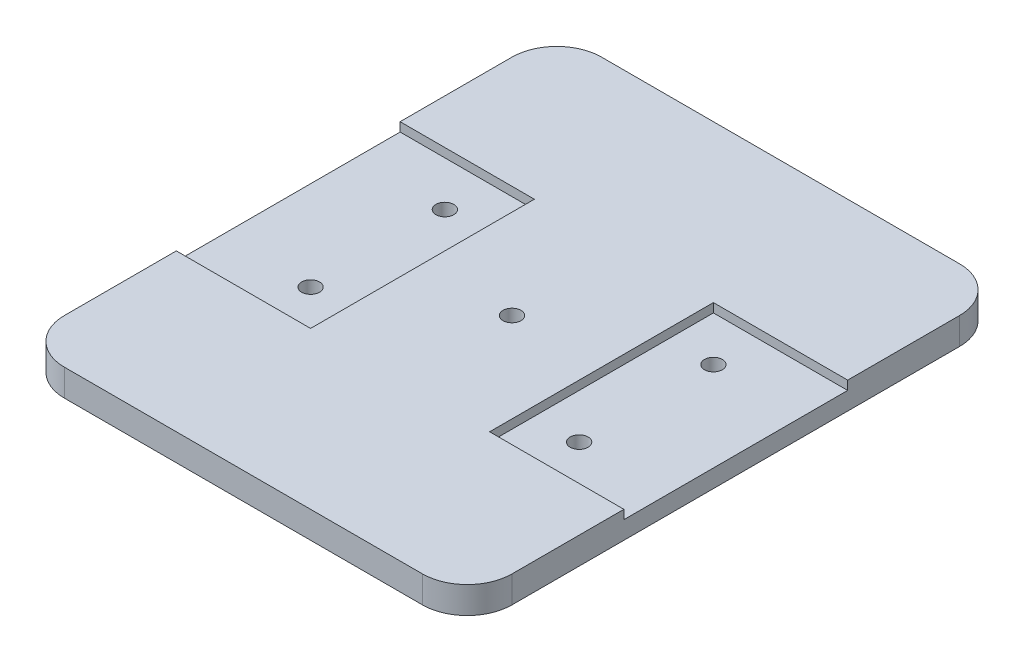
ISO-10303-21;
HEADER;
FILE_DESCRIPTION(('STEP AP214'),'2;1');
FILE_NAME('part.step','',(''),(''),'','','');
FILE_SCHEMA(('AUTOMOTIVE_DESIGN { 1 0 10303 214 1 1 1 1 }'));
ENDSEC;
DATA;
#1=APPLICATION_CONTEXT('core data for automotive mechanical design processes');
#2=APPLICATION_PROTOCOL_DEFINITION('international standard','automotive_design',2000,#1);
#3=PRODUCT_CONTEXT('',#1,'mechanical');
#4=PRODUCT('Part','Part','',(#3));
#5=PRODUCT_RELATED_PRODUCT_CATEGORY('part','',(#4));
#6=PRODUCT_DEFINITION_FORMATION('','',#4);
#7=PRODUCT_DEFINITION_CONTEXT('part definition',#1,'design');
#8=PRODUCT_DEFINITION('design','',#6,#7);
#9=PRODUCT_DEFINITION_SHAPE('','',#8);
#10=(LENGTH_UNIT() NAMED_UNIT(*) SI_UNIT(.MILLI.,.METRE.));
#11=(NAMED_UNIT(*) PLANE_ANGLE_UNIT() SI_UNIT($,.RADIAN.));
#12=(NAMED_UNIT(*) SI_UNIT($,.STERADIAN.) SOLID_ANGLE_UNIT());
#13=UNCERTAINTY_MEASURE_WITH_UNIT(LENGTH_MEASURE(1.E-05),#10,'distance_accuracy_value','');
#14=(GEOMETRIC_REPRESENTATION_CONTEXT(3) GLOBAL_UNCERTAINTY_ASSIGNED_CONTEXT((#13)) GLOBAL_UNIT_ASSIGNED_CONTEXT((#10,
#11,#12)) REPRESENTATION_CONTEXT('',''));
#15=CARTESIAN_POINT('',(0.,0.,0.));
#16=DIRECTION('',(0.,0.,1.));
#17=DIRECTION('',(1.,0.,0.));
#18=AXIS2_PLACEMENT_3D('',#15,#16,#17);
#19=CARTESIAN_POINT('',(-47.2549019607844,3.,-3.77450980392158));
#20=DIRECTION('',(0.,-1.,0.));
#21=DIRECTION('',(0.,0.,-1.));
#22=AXIS2_PLACEMENT_3D('',#19,#20,#21);
#23=CYLINDRICAL_SURFACE('',#22,0.999999999999998);
#24=CARTESIAN_POINT('',(-47.2549019607844,0.,-3.77450980392158));
#25=DIRECTION('',(0.,1.,0.));
#26=DIRECTION('',(0.,0.,1.));
#27=AXIS2_PLACEMENT_3D('',#24,#25,#26);
#28=CIRCLE('',#27,0.999999999999998);
#29=CARTESIAN_POINT('',(-47.2549019607844,0.,-2.77450980392158));
#30=VERTEX_POINT('',#29);
#31=EDGE_CURVE('E251',#30,#30,#28,.T.);
#32=ORIENTED_EDGE('',*,*,#31,.F.);
#33=EDGE_LOOP('',(#32));
#34=FACE_BOUND('',#33,.T.);
#35=CARTESIAN_POINT('',(-47.2549019607844,2.,-3.77450980392158));
#36=DIRECTION('',(0.,1.,0.));
#37=DIRECTION('',(0.,0.,1.));
#38=AXIS2_PLACEMENT_3D('',#35,#36,#37);
#39=CIRCLE('',#38,0.999999999999998);
#40=CARTESIAN_POINT('',(-47.2549019607844,2.,-2.77450980392158));
#41=VERTEX_POINT('',#40);
#42=EDGE_CURVE('E235',#41,#41,#39,.T.);
#43=ORIENTED_EDGE('',*,*,#42,.T.);
#44=EDGE_LOOP('',(#43));
#45=FACE_BOUND('',#44,.T.);
#46=ADVANCED_FACE('F43',(#34,#45),#23,.F.);
#47=CARTESIAN_POINT('',(-47.2549019607844,3.,11.2254901960784));
#48=DIRECTION('',(0.,-1.,0.));
#49=DIRECTION('',(0.,0.,-1.));
#50=AXIS2_PLACEMENT_3D('',#47,#48,#49);
#51=CYLINDRICAL_SURFACE('',#50,0.999999999999998);
#52=CARTESIAN_POINT('',(-47.2549019607844,0.,11.2254901960784));
#53=DIRECTION('',(0.,1.,0.));
#54=DIRECTION('',(0.,0.,1.));
#55=AXIS2_PLACEMENT_3D('',#52,#53,#54);
#56=CIRCLE('',#55,0.999999999999998);
#57=CARTESIAN_POINT('',(-47.2549019607844,0.,12.2254901960784));
#58=VERTEX_POINT('',#57);
#59=EDGE_CURVE('E247',#58,#58,#56,.T.);
#60=ORIENTED_EDGE('',*,*,#59,.F.);
#61=EDGE_LOOP('',(#60));
#62=FACE_BOUND('',#61,.T.);
#63=CARTESIAN_POINT('',(-47.2549019607844,2.,11.2254901960784));
#64=DIRECTION('',(0.,1.,0.));
#65=DIRECTION('',(0.,0.,1.));
#66=AXIS2_PLACEMENT_3D('',#63,#64,#65);
#67=CIRCLE('',#66,0.999999999999998);
#68=CARTESIAN_POINT('',(-47.2549019607844,2.,12.2254901960784));
#69=VERTEX_POINT('',#68);
#70=EDGE_CURVE('E226',#69,#69,#67,.T.);
#71=ORIENTED_EDGE('',*,*,#70,.T.);
#72=EDGE_LOOP('',(#71));
#73=FACE_BOUND('',#72,.T.);
#74=ADVANCED_FACE('F346',(#62,#73),#51,.F.);
#75=CARTESIAN_POINT('',(-52.2549019607844,3.,28.7254901960784));
#76=DIRECTION('',(0.,1.,0.));
#77=DIRECTION('',(0.,0.,1.));
#78=AXIS2_PLACEMENT_3D('',#75,#76,#77);
#79=PLANE('',#78);
#80=DIRECTION('',(1.,0.,0.));
#81=VECTOR('',#80,1.);
#82=CARTESIAN_POINT('',(-7.25490196078435,3.,16.2254901960784));
#83=LINE('',#82,#81);
#84=CARTESIAN_POINT('',(-22.2549019607843,3.,16.2254901960784));
#85=VERTEX_POINT('',#84);
#86=CARTESIAN_POINT('',(-7.25490196078435,3.,16.2254901960784));
#87=VERTEX_POINT('',#86);
#88=EDGE_CURVE('E179',#85,#87,#83,.T.);
#89=ORIENTED_EDGE('',*,*,#88,.F.);
#90=DIRECTION('',(0.,0.,1.));
#91=VECTOR('',#90,1.);
#92=CARTESIAN_POINT('',(-22.2549019607843,3.,-8.77450980392157));
#93=LINE('',#92,#91);
#94=CARTESIAN_POINT('',(-22.2549019607843,3.,-8.77450980392157));
#95=VERTEX_POINT('',#94);
#96=EDGE_CURVE('E403',#95,#85,#93,.T.);
#97=ORIENTED_EDGE('',*,*,#96,.F.);
#98=DIRECTION('',(-1.,0.,0.));
#99=VECTOR('',#98,1.);
#100=CARTESIAN_POINT('',(-7.25490196078435,3.,-8.77450980392157));
#101=LINE('',#100,#99);
#102=CARTESIAN_POINT('',(-7.25490196078435,3.,-8.77450980392157));
#103=VERTEX_POINT('',#102);
#104=EDGE_CURVE('E408',#103,#95,#101,.T.);
#105=ORIENTED_EDGE('',*,*,#104,.F.);
#106=DIRECTION('',(0.,0.,-1.));
#107=VECTOR('',#106,1.);
#108=CARTESIAN_POINT('',(-7.25490196078435,3.,-21.2745098039215));
#109=LINE('',#108,#107);
#110=CARTESIAN_POINT('',(-7.25490196078435,3.,-21.2745098039215));
#111=VERTEX_POINT('',#110);
#112=EDGE_CURVE('E184',#103,#111,#109,.T.);
#113=ORIENTED_EDGE('',*,*,#112,.T.);
#114=CARTESIAN_POINT('',(-12.2549019607843,3.,-21.2745098039216));
#115=DIRECTION('',(0.,1.,0.));
#116=DIRECTION('',(0.,0.,-1.));
#117=AXIS2_PLACEMENT_3D('',#114,#115,#116);
#118=CIRCLE('',#117,5.);
#119=CARTESIAN_POINT('',(-12.2549019607844,3.,-26.2745098039216));
#120=VERTEX_POINT('',#119);
#121=EDGE_CURVE('E279',#111,#120,#118,.T.);
#122=ORIENTED_EDGE('',*,*,#121,.T.);
#123=DIRECTION('',(-1.,0.,0.));
#124=VECTOR('',#123,1.);
#125=CARTESIAN_POINT('',(-52.2549019607843,3.,-26.2745098039216));
#126=LINE('',#125,#124);
#127=CARTESIAN_POINT('',(-52.2549019607843,3.,-26.2745098039216));
#128=VERTEX_POINT('',#127);
#129=EDGE_CURVE('E282',#120,#128,#126,.T.);
#130=ORIENTED_EDGE('',*,*,#129,.T.);
#131=CARTESIAN_POINT('',(-52.2549019607844,3.,-21.2745098039216));
#132=DIRECTION('',(0.,1.,0.));
#133=DIRECTION('',(0.,0.,1.));
#134=AXIS2_PLACEMENT_3D('',#131,#132,#133);
#135=CIRCLE('',#134,5.);
#136=CARTESIAN_POINT('',(-57.2549019607844,3.,-21.2745098039215));
#137=VERTEX_POINT('',#136);
#138=EDGE_CURVE('E285',#128,#137,#135,.T.);
#139=ORIENTED_EDGE('',*,*,#138,.T.);
#140=DIRECTION('',(0.,0.,1.));
#141=VECTOR('',#140,1.);
#142=CARTESIAN_POINT('',(-57.2549019607844,3.,-21.2745098039215));
#143=LINE('',#142,#141);
#144=CARTESIAN_POINT('',(-57.2549019607844,3.,-8.77450980392157));
#145=VERTEX_POINT('',#144);
#146=EDGE_CURVE('E289',#137,#145,#143,.T.);
#147=ORIENTED_EDGE('',*,*,#146,.T.);
#148=DIRECTION('',(-1.,0.,0.));
#149=VECTOR('',#148,1.);
#150=CARTESIAN_POINT('',(-57.2549019607844,3.,-8.77450980392157));
#151=LINE('',#150,#149);
#152=CARTESIAN_POINT('',(-42.2549019607844,3.,-8.77450980392157));
#153=VERTEX_POINT('',#152);
#154=EDGE_CURVE('E203',#153,#145,#151,.T.);
#155=ORIENTED_EDGE('',*,*,#154,.F.);
#156=DIRECTION('',(0.,0.,-1.));
#157=VECTOR('',#156,1.);
#158=CARTESIAN_POINT('',(-42.2549019607844,3.,-8.77450980392157));
#159=LINE('',#158,#157);
#160=CARTESIAN_POINT('',(-42.2549019607844,3.,16.2254901960784));
#161=VERTEX_POINT('',#160);
#162=EDGE_CURVE('E216',#161,#153,#159,.T.);
#163=ORIENTED_EDGE('',*,*,#162,.F.);
#164=DIRECTION('',(1.,0.,0.));
#165=VECTOR('',#164,1.);
#166=CARTESIAN_POINT('',(-57.2549019607844,3.,16.2254901960784));
#167=LINE('',#166,#165);
#168=CARTESIAN_POINT('',(-57.2549019607844,3.,16.2254901960784));
#169=VERTEX_POINT('',#168);
#170=EDGE_CURVE('E198',#169,#161,#167,.T.);
#171=ORIENTED_EDGE('',*,*,#170,.F.);
#172=CARTESIAN_POINT('',(-57.2549019607844,3.,28.7254901960784));
#173=VERTEX_POINT('',#172);
#174=EDGE_CURVE('E288',#169,#173,#143,.T.);
#175=ORIENTED_EDGE('',*,*,#174,.T.);
#176=CARTESIAN_POINT('',(-52.2549019607844,3.,28.7254901960784));
#177=DIRECTION('',(0.,1.,0.));
#178=DIRECTION('',(0.,0.,1.));
#179=AXIS2_PLACEMENT_3D('',#176,#177,#178);
#180=CIRCLE('',#179,5.);
#181=CARTESIAN_POINT('',(-52.2549019607843,3.,33.7254901960784));
#182=VERTEX_POINT('',#181);
#183=EDGE_CURVE('E264',#173,#182,#180,.T.);
#184=ORIENTED_EDGE('',*,*,#183,.T.);
#185=DIRECTION('',(1.,0.,0.));
#186=VECTOR('',#185,1.);
#187=CARTESIAN_POINT('',(-52.2549019607843,3.,33.7254901960784));
#188=LINE('',#187,#186);
#189=CARTESIAN_POINT('',(-12.2549019607844,3.,33.7254901960784));
#190=VERTEX_POINT('',#189);
#191=EDGE_CURVE('E268',#182,#190,#188,.T.);
#192=ORIENTED_EDGE('',*,*,#191,.T.);
#193=CARTESIAN_POINT('',(-12.2549019607843,3.,28.7254901960784));
#194=DIRECTION('',(0.,1.,0.));
#195=DIRECTION('',(0.,0.,1.));
#196=AXIS2_PLACEMENT_3D('',#193,#194,#195);
#197=CIRCLE('',#196,5.);
#198=CARTESIAN_POINT('',(-7.25490196078435,3.,28.7254901960784));
#199=VERTEX_POINT('',#198);
#200=EDGE_CURVE('E272',#190,#199,#197,.T.);
#201=ORIENTED_EDGE('',*,*,#200,.T.);
#202=EDGE_CURVE('E275',#199,#87,#109,.T.);
#203=ORIENTED_EDGE('',*,*,#202,.T.);
#204=EDGE_LOOP('',(#89,#97,#105,#113,#122,#130,#139,#147,#155,#163,#171,#175,#184,#192,#201,#203));
#205=FACE_BOUND('',#204,.T.);
#206=CARTESIAN_POINT('',(-32.2549019607844,3.,3.72549019607842));
#207=DIRECTION('',(0.,1.,0.));
#208=DIRECTION('',(0.,0.,1.));
#209=AXIS2_PLACEMENT_3D('',#206,#207,#208);
#210=CIRCLE('',#209,0.999999999999998);
#211=CARTESIAN_POINT('',(-32.2549019607844,3.,4.72549019607842));
#212=VERTEX_POINT('',#211);
#213=EDGE_CURVE('E256',#212,#212,#210,.T.);
#214=ORIENTED_EDGE('',*,*,#213,.F.);
#215=EDGE_LOOP('',(#214));
#216=FACE_BOUND('',#215,.T.);
#217=ADVANCED_FACE('F365',(#205,#216),#79,.T.);
#218=CARTESIAN_POINT('',(-52.2549019607844,0.,28.7254901960784));
#219=DIRECTION('',(0.,1.,0.));
#220=DIRECTION('',(0.,0.,1.));
#221=AXIS2_PLACEMENT_3D('',#218,#219,#220);
#222=PLANE('',#221);
#223=CARTESIAN_POINT('',(-52.2549019607844,0.,28.7254901960784));
#224=DIRECTION('',(0.,1.,0.));
#225=DIRECTION('',(0.,0.,1.));
#226=AXIS2_PLACEMENT_3D('',#223,#224,#225);
#227=CIRCLE('',#226,5.);
#228=CARTESIAN_POINT('',(-57.2549019607844,0.,28.7254901960784));
#229=VERTEX_POINT('',#228);
#230=CARTESIAN_POINT('',(-52.2549019607843,0.,33.7254901960784));
#231=VERTEX_POINT('',#230);
#232=EDGE_CURVE('E260',#229,#231,#227,.T.);
#233=ORIENTED_EDGE('',*,*,#232,.F.);
#234=DIRECTION('',(0.,0.,1.));
#235=VECTOR('',#234,1.);
#236=CARTESIAN_POINT('',(-57.2549019607844,0.,-21.2745098039215));
#237=LINE('',#236,#235);
#238=CARTESIAN_POINT('',(-57.2549019607844,0.,-21.2745098039215));
#239=VERTEX_POINT('',#238);
#240=EDGE_CURVE('E269',#239,#229,#237,.T.);
#241=ORIENTED_EDGE('',*,*,#240,.F.);
#242=CARTESIAN_POINT('',(-52.2549019607844,0.,-21.2745098039216));
#243=DIRECTION('',(0.,1.,0.));
#244=DIRECTION('',(0.,0.,1.));
#245=AXIS2_PLACEMENT_3D('',#242,#243,#244);
#246=CIRCLE('',#245,5.);
#247=CARTESIAN_POINT('',(-52.2549019607843,0.,-26.2745098039216));
#248=VERTEX_POINT('',#247);
#249=EDGE_CURVE('E312',#248,#239,#246,.T.);
#250=ORIENTED_EDGE('',*,*,#249,.F.);
#251=DIRECTION('',(-1.,0.,0.));
#252=VECTOR('',#251,1.);
#253=CARTESIAN_POINT('',(-52.2549019607843,0.,-26.2745098039216));
#254=LINE('',#253,#252);
#255=CARTESIAN_POINT('',(-12.2549019607844,0.,-26.2745098039216));
#256=VERTEX_POINT('',#255);
#257=EDGE_CURVE('E309',#256,#248,#254,.T.);
#258=ORIENTED_EDGE('',*,*,#257,.F.);
#259=CARTESIAN_POINT('',(-12.2549019607843,0.,-21.2745098039216));
#260=DIRECTION('',(0.,1.,0.));
#261=DIRECTION('',(0.,0.,-1.));
#262=AXIS2_PLACEMENT_3D('',#259,#260,#261);
#263=CIRCLE('',#262,5.);
#264=CARTESIAN_POINT('',(-7.25490196078435,0.,-21.2745098039215));
#265=VERTEX_POINT('',#264);
#266=EDGE_CURVE('E306',#265,#256,#263,.T.);
#267=ORIENTED_EDGE('',*,*,#266,.F.);
#268=DIRECTION('',(0.,0.,-1.));
#269=VECTOR('',#268,1.);
#270=CARTESIAN_POINT('',(-7.25490196078435,0.,-21.2745098039215));
#271=LINE('',#270,#269);
#272=CARTESIAN_POINT('',(-7.25490196078435,0.,28.7254901960784));
#273=VERTEX_POINT('',#272);
#274=EDGE_CURVE('E303',#273,#265,#271,.T.);
#275=ORIENTED_EDGE('',*,*,#274,.F.);
#276=CARTESIAN_POINT('',(-12.2549019607843,0.,28.7254901960784));
#277=DIRECTION('',(0.,1.,0.));
#278=DIRECTION('',(0.,0.,1.));
#279=AXIS2_PLACEMENT_3D('',#276,#277,#278);
#280=CIRCLE('',#279,5.);
#281=CARTESIAN_POINT('',(-12.2549019607844,0.,33.7254901960784));
#282=VERTEX_POINT('',#281);
#283=EDGE_CURVE('E300',#282,#273,#280,.T.);
#284=ORIENTED_EDGE('',*,*,#283,.F.);
#285=DIRECTION('',(1.,0.,0.));
#286=VECTOR('',#285,1.);
#287=CARTESIAN_POINT('',(-52.2549019607843,0.,33.7254901960784));
#288=LINE('',#287,#286);
#289=EDGE_CURVE('E297',#231,#282,#288,.T.);
#290=ORIENTED_EDGE('',*,*,#289,.F.);
#291=EDGE_LOOP('',(#233,#241,#250,#258,#267,#275,#284,#290));
#292=FACE_BOUND('',#291,.T.);
#293=CARTESIAN_POINT('',(-32.2549019607844,0.,3.72549019607842));
#294=DIRECTION('',(0.,1.,0.));
#295=DIRECTION('',(0.,0.,1.));
#296=AXIS2_PLACEMENT_3D('',#293,#294,#295);
#297=CIRCLE('',#296,0.999999999999998);
#298=CARTESIAN_POINT('',(-32.2549019607844,0.,4.72549019607842));
#299=VERTEX_POINT('',#298);
#300=EDGE_CURVE('E255',#299,#299,#297,.T.);
#301=ORIENTED_EDGE('',*,*,#300,.T.);
#302=EDGE_LOOP('',(#301));
#303=FACE_BOUND('',#302,.T.);
#304=ORIENTED_EDGE('',*,*,#31,.T.);
#305=EDGE_LOOP('',(#304));
#306=FACE_BOUND('',#305,.T.);
#307=ORIENTED_EDGE('',*,*,#59,.T.);
#308=EDGE_LOOP('',(#307));
#309=FACE_BOUND('',#308,.T.);
#310=CARTESIAN_POINT('',(-17.2549019607844,0.,-3.77450980392158));
#311=DIRECTION('',(0.,1.,0.));
#312=DIRECTION('',(0.,0.,1.));
#313=AXIS2_PLACEMENT_3D('',#310,#311,#312);
#314=CIRCLE('',#313,1.);
#315=CARTESIAN_POINT('',(-17.2549019607844,0.,-2.77450980392158));
#316=VERTEX_POINT('',#315);
#317=EDGE_CURVE('E243',#316,#316,#314,.T.);
#318=ORIENTED_EDGE('',*,*,#317,.T.);
#319=EDGE_LOOP('',(#318));
#320=FACE_BOUND('',#319,.T.);
#321=CARTESIAN_POINT('',(-17.2549019607844,0.,11.2254901960784));
#322=DIRECTION('',(0.,1.,0.));
#323=DIRECTION('',(0.,0.,1.));
#324=AXIS2_PLACEMENT_3D('',#321,#322,#323);
#325=CIRCLE('',#324,1.);
#326=CARTESIAN_POINT('',(-17.2549019607844,0.,12.2254901960784));
#327=VERTEX_POINT('',#326);
#328=EDGE_CURVE('E239',#327,#327,#325,.T.);
#329=ORIENTED_EDGE('',*,*,#328,.T.);
#330=EDGE_LOOP('',(#329));
#331=FACE_BOUND('',#330,.T.);
#332=ADVANCED_FACE('F384',(#292,#303,#306,#309,#320,#331),#222,.F.);
#333=CARTESIAN_POINT('',(-52.2549019607844,3.,28.7254901960784));
#334=DIRECTION('',(0.,-1.,0.));
#335=DIRECTION('',(0.,0.,-1.));
#336=AXIS2_PLACEMENT_3D('',#333,#334,#335);
#337=CYLINDRICAL_SURFACE('',#336,5.);
#338=ORIENTED_EDGE('',*,*,#232,.T.);
#339=DIRECTION('',(0.,-1.,0.));
#340=VECTOR('',#339,1.);
#341=CARTESIAN_POINT('',(-52.2549019607843,3.,33.7254901960784));
#342=LINE('',#341,#340);
#343=EDGE_CURVE('E11',#182,#231,#342,.T.);
#344=ORIENTED_EDGE('',*,*,#343,.F.);
#345=ORIENTED_EDGE('',*,*,#183,.F.);
#346=DIRECTION('',(0.,-1.,0.));
#347=VECTOR('',#346,1.);
#348=CARTESIAN_POINT('',(-57.2549019607844,3.,28.7254901960784));
#349=LINE('',#348,#347);
#350=EDGE_CURVE('E293',#173,#229,#349,.T.);
#351=ORIENTED_EDGE('',*,*,#350,.T.);
#352=EDGE_LOOP('',(#338,#344,#345,#351));
#353=FACE_BOUND('',#352,.T.);
#354=ADVANCED_FACE('F45',(#353),#337,.T.);
#355=CARTESIAN_POINT('',(-52.2549019607843,3.,33.7254901960784));
#356=DIRECTION('',(0.,0.,-1.));
#357=DIRECTION('',(-1.,0.,0.));
#358=AXIS2_PLACEMENT_3D('',#355,#356,#357);
#359=PLANE('',#358);
#360=ORIENTED_EDGE('',*,*,#289,.T.);
#361=DIRECTION('',(0.,-1.,0.));
#362=VECTOR('',#361,1.);
#363=CARTESIAN_POINT('',(-12.2549019607844,3.,33.7254901960784));
#364=LINE('',#363,#362);
#365=EDGE_CURVE('E53',#190,#282,#364,.T.);
#366=ORIENTED_EDGE('',*,*,#365,.F.);
#367=ORIENTED_EDGE('',*,*,#191,.F.);
#368=ORIENTED_EDGE('',*,*,#343,.T.);
#369=EDGE_LOOP('',(#360,#366,#367,#368));
#370=FACE_BOUND('',#369,.T.);
#371=ADVANCED_FACE('F395',(#370),#359,.F.);
#372=CARTESIAN_POINT('',(-12.2549019607843,3.,28.7254901960784));
#373=DIRECTION('',(0.,-1.,0.));
#374=DIRECTION('',(0.,0.,-1.));
#375=AXIS2_PLACEMENT_3D('',#372,#373,#374);
#376=CYLINDRICAL_SURFACE('',#375,5.);
#377=ORIENTED_EDGE('',*,*,#283,.T.);
#378=DIRECTION('',(0.,-1.,0.));
#379=VECTOR('',#378,1.);
#380=CARTESIAN_POINT('',(-7.25490196078435,3.,28.7254901960784));
#381=LINE('',#380,#379);
#382=EDGE_CURVE('E336',#199,#273,#381,.T.);
#383=ORIENTED_EDGE('',*,*,#382,.F.);
#384=ORIENTED_EDGE('',*,*,#200,.F.);
#385=ORIENTED_EDGE('',*,*,#365,.T.);
#386=EDGE_LOOP('',(#377,#383,#384,#385));
#387=FACE_BOUND('',#386,.T.);
#388=ADVANCED_FACE('F397',(#387),#376,.T.);
#389=CARTESIAN_POINT('',(-7.25490196078435,3.,-21.2745098039215));
#390=DIRECTION('',(-1.,0.,0.));
#391=DIRECTION('',(0.,0.,1.));
#392=AXIS2_PLACEMENT_3D('',#389,#390,#391);
#393=PLANE('',#392);
#394=DIRECTION('',(0.,0.,-1.));
#395=VECTOR('',#394,1.);
#396=CARTESIAN_POINT('',(-7.25490196078435,2.,-8.77450980392157));
#397=LINE('',#396,#395);
#398=CARTESIAN_POINT('',(-7.25490196078435,2.,16.2254901960784));
#399=VERTEX_POINT('',#398);
#400=CARTESIAN_POINT('',(-7.25490196078435,2.,-8.77450980392157));
#401=VERTEX_POINT('',#400);
#402=EDGE_CURVE('E172',#399,#401,#397,.T.);
#403=ORIENTED_EDGE('',*,*,#402,.F.);
#404=DIRECTION('',(0.,1.,0.));
#405=VECTOR('',#404,1.);
#406=CARTESIAN_POINT('',(-7.25490196078435,2.,16.2254901960784));
#407=LINE('',#406,#405);
#408=EDGE_CURVE('E400',#399,#87,#407,.T.);
#409=ORIENTED_EDGE('',*,*,#408,.T.);
#410=ORIENTED_EDGE('',*,*,#202,.F.);
#411=ORIENTED_EDGE('',*,*,#382,.T.);
#412=ORIENTED_EDGE('',*,*,#274,.T.);
#413=DIRECTION('',(0.,-1.,0.));
#414=VECTOR('',#413,1.);
#415=CARTESIAN_POINT('',(-7.25490196078435,3.,-21.2745098039215));
#416=LINE('',#415,#414);
#417=EDGE_CURVE('E332',#111,#265,#416,.T.);
#418=ORIENTED_EDGE('',*,*,#417,.F.);
#419=ORIENTED_EDGE('',*,*,#112,.F.);
#420=DIRECTION('',(0.,1.,0.));
#421=VECTOR('',#420,1.);
#422=CARTESIAN_POINT('',(-7.25490196078435,2.,-8.77450980392157));
#423=LINE('',#422,#421);
#424=EDGE_CURVE('E166',#401,#103,#423,.T.);
#425=ORIENTED_EDGE('',*,*,#424,.F.);
#426=EDGE_LOOP('',(#403,#409,#410,#411,#412,#418,#419,#425));
#427=FACE_BOUND('',#426,.T.);
#428=ADVANCED_FACE('F182',(#427),#393,.F.);
#429=CARTESIAN_POINT('',(-12.2549019607843,3.,-21.2745098039216));
#430=DIRECTION('',(0.,-1.,0.));
#431=DIRECTION('',(0.,0.,-1.));
#432=AXIS2_PLACEMENT_3D('',#429,#430,#431);
#433=CYLINDRICAL_SURFACE('',#432,5.);
#434=ORIENTED_EDGE('',*,*,#266,.T.);
#435=DIRECTION('',(0.,-1.,0.));
#436=VECTOR('',#435,1.);
#437=CARTESIAN_POINT('',(-12.2549019607844,3.,-26.2745098039216));
#438=LINE('',#437,#436);
#439=EDGE_CURVE('E328',#120,#256,#438,.T.);
#440=ORIENTED_EDGE('',*,*,#439,.F.);
#441=ORIENTED_EDGE('',*,*,#121,.F.);
#442=ORIENTED_EDGE('',*,*,#417,.T.);
#443=EDGE_LOOP('',(#434,#440,#441,#442));
#444=FACE_BOUND('',#443,.T.);
#445=ADVANCED_FACE('F424',(#444),#433,.T.);
#446=CARTESIAN_POINT('',(-52.2549019607843,3.,-26.2745098039216));
#447=DIRECTION('',(0.,0.,1.));
#448=DIRECTION('',(1.,0.,0.));
#449=AXIS2_PLACEMENT_3D('',#446,#447,#448);
#450=PLANE('',#449);
#451=ORIENTED_EDGE('',*,*,#257,.T.);
#452=DIRECTION('',(0.,-1.,0.));
#453=VECTOR('',#452,1.);
#454=CARTESIAN_POINT('',(-52.2549019607843,3.,-26.2745098039216));
#455=LINE('',#454,#453);
#456=EDGE_CURVE('E324',#128,#248,#455,.T.);
#457=ORIENTED_EDGE('',*,*,#456,.F.);
#458=ORIENTED_EDGE('',*,*,#129,.F.);
#459=ORIENTED_EDGE('',*,*,#439,.T.);
#460=EDGE_LOOP('',(#451,#457,#458,#459));
#461=FACE_BOUND('',#460,.T.);
#462=ADVANCED_FACE('F426',(#461),#450,.F.);
#463=CARTESIAN_POINT('',(-52.2549019607844,3.,-21.2745098039216));
#464=DIRECTION('',(0.,-1.,0.));
#465=DIRECTION('',(0.,0.,-1.));
#466=AXIS2_PLACEMENT_3D('',#463,#464,#465);
#467=CYLINDRICAL_SURFACE('',#466,5.);
#468=ORIENTED_EDGE('',*,*,#249,.T.);
#469=DIRECTION('',(0.,-1.,0.));
#470=VECTOR('',#469,1.);
#471=CARTESIAN_POINT('',(-57.2549019607844,3.,-21.2745098039215));
#472=LINE('',#471,#470);
#473=EDGE_CURVE('E320',#137,#239,#472,.T.);
#474=ORIENTED_EDGE('',*,*,#473,.F.);
#475=ORIENTED_EDGE('',*,*,#138,.F.);
#476=ORIENTED_EDGE('',*,*,#456,.T.);
#477=EDGE_LOOP('',(#468,#474,#475,#476));
#478=FACE_BOUND('',#477,.T.);
#479=ADVANCED_FACE('F379',(#478),#467,.T.);
#480=CARTESIAN_POINT('',(-57.2549019607844,3.,-21.2745098039215));
#481=DIRECTION('',(1.,0.,0.));
#482=DIRECTION('',(0.,0.,-1.));
#483=AXIS2_PLACEMENT_3D('',#480,#481,#482);
#484=PLANE('',#483);
#485=DIRECTION('',(0.,0.,1.));
#486=VECTOR('',#485,1.);
#487=CARTESIAN_POINT('',(-57.2549019607844,2.,-8.77450980392157));
#488=LINE('',#487,#486);
#489=CARTESIAN_POINT('',(-57.2549019607844,2.,-8.77450980392157));
#490=VERTEX_POINT('',#489);
#491=CARTESIAN_POINT('',(-57.2549019607844,2.,16.2254901960784));
#492=VERTEX_POINT('',#491);
#493=EDGE_CURVE('E199',#490,#492,#488,.T.);
#494=ORIENTED_EDGE('',*,*,#493,.F.);
#495=DIRECTION('',(0.,1.,0.));
#496=VECTOR('',#495,1.);
#497=CARTESIAN_POINT('',(-57.2549019607844,2.,-8.77450980392157));
#498=LINE('',#497,#496);
#499=EDGE_CURVE('E222',#490,#145,#498,.T.);
#500=ORIENTED_EDGE('',*,*,#499,.T.);
#501=ORIENTED_EDGE('',*,*,#146,.F.);
#502=ORIENTED_EDGE('',*,*,#473,.T.);
#503=ORIENTED_EDGE('',*,*,#240,.T.);
#504=ORIENTED_EDGE('',*,*,#350,.F.);
#505=ORIENTED_EDGE('',*,*,#174,.F.);
#506=DIRECTION('',(0.,1.,0.));
#507=VECTOR('',#506,1.);
#508=CARTESIAN_POINT('',(-57.2549019607844,2.,16.2254901960784));
#509=LINE('',#508,#507);
#510=EDGE_CURVE('E212',#492,#169,#509,.T.);
#511=ORIENTED_EDGE('',*,*,#510,.F.);
#512=EDGE_LOOP('',(#494,#500,#501,#502,#503,#504,#505,#511));
#513=FACE_BOUND('',#512,.T.);
#514=ADVANCED_FACE('F358',(#513),#484,.F.);
#515=CARTESIAN_POINT('',(-32.2549019607844,3.,3.72549019607842));
#516=DIRECTION('',(0.,-1.,0.));
#517=DIRECTION('',(0.,0.,-1.));
#518=AXIS2_PLACEMENT_3D('',#515,#516,#517);
#519=CYLINDRICAL_SURFACE('',#518,0.999999999999998);
#520=ORIENTED_EDGE('',*,*,#213,.T.);
#521=EDGE_LOOP('',(#520));
#522=FACE_BOUND('',#521,.T.);
#523=ORIENTED_EDGE('',*,*,#300,.F.);
#524=EDGE_LOOP('',(#523));
#525=FACE_BOUND('',#524,.T.);
#526=ADVANCED_FACE('F447',(#522,#525),#519,.F.);
#527=CARTESIAN_POINT('',(-17.2549019607844,3.,-3.77450980392158));
#528=DIRECTION('',(0.,-1.,0.));
#529=DIRECTION('',(0.,0.,-1.));
#530=AXIS2_PLACEMENT_3D('',#527,#528,#529);
#531=CYLINDRICAL_SURFACE('',#530,1.);
#532=CARTESIAN_POINT('',(-17.2549019607844,2.,-3.77450980392158));
#533=DIRECTION('',(0.,-1.,0.));
#534=DIRECTION('',(0.,0.,-1.));
#535=AXIS2_PLACEMENT_3D('',#532,#533,#534);
#536=CIRCLE('',#535,1.);
#537=CARTESIAN_POINT('',(-17.2549019607844,2.,-4.77450980392159));
#538=VERTEX_POINT('',#537);
#539=EDGE_CURVE('E194',#538,#538,#536,.T.);
#540=ORIENTED_EDGE('',*,*,#539,.F.);
#541=EDGE_LOOP('',(#540));
#542=FACE_BOUND('',#541,.T.);
#543=ORIENTED_EDGE('',*,*,#317,.F.);
#544=EDGE_LOOP('',(#543));
#545=FACE_BOUND('',#544,.T.);
#546=ADVANCED_FACE('F450',(#542,#545),#531,.F.);
#547=CARTESIAN_POINT('',(-17.2549019607844,3.,11.2254901960784));
#548=DIRECTION('',(0.,-1.,0.));
#549=DIRECTION('',(0.,0.,-1.));
#550=AXIS2_PLACEMENT_3D('',#547,#548,#549);
#551=CYLINDRICAL_SURFACE('',#550,1.);
#552=CARTESIAN_POINT('',(-17.2549019607844,2.,11.2254901960784));
#553=DIRECTION('',(0.,-1.,0.));
#554=DIRECTION('',(0.,0.,-1.));
#555=AXIS2_PLACEMENT_3D('',#552,#553,#554);
#556=CIRCLE('',#555,1.);
#557=CARTESIAN_POINT('',(-17.2549019607844,2.,10.2254901960784));
#558=VERTEX_POINT('',#557);
#559=EDGE_CURVE('E47',#558,#558,#556,.T.);
#560=ORIENTED_EDGE('',*,*,#559,.F.);
#561=EDGE_LOOP('',(#560));
#562=FACE_BOUND('',#561,.T.);
#563=ORIENTED_EDGE('',*,*,#328,.F.);
#564=EDGE_LOOP('',(#563));
#565=FACE_BOUND('',#564,.T.);
#566=ADVANCED_FACE('F473',(#562,#565),#551,.F.);
#567=CARTESIAN_POINT('',(-57.2549019607844,2.,-8.77450980392157));
#568=DIRECTION('',(0.,0.,-1.));
#569=DIRECTION('',(-1.,0.,0.));
#570=AXIS2_PLACEMENT_3D('',#567,#568,#569);
#571=PLANE('',#570);
#572=ORIENTED_EDGE('',*,*,#154,.T.);
#573=ORIENTED_EDGE('',*,*,#499,.F.);
#574=DIRECTION('',(-1.,0.,0.));
#575=VECTOR('',#574,1.);
#576=CARTESIAN_POINT('',(-57.2549019607844,2.,-8.77450980392157));
#577=LINE('',#576,#575);
#578=CARTESIAN_POINT('',(-42.2549019607844,2.,-8.77450980392157));
#579=VERTEX_POINT('',#578);
#580=EDGE_CURVE('E69',#579,#490,#577,.T.);
#581=ORIENTED_EDGE('',*,*,#580,.F.);
#582=DIRECTION('',(0.,1.,0.));
#583=VECTOR('',#582,1.);
#584=CARTESIAN_POINT('',(-42.2549019607844,2.,-8.77450980392157));
#585=LINE('',#584,#583);
#586=EDGE_CURVE('E227',#579,#153,#585,.T.);
#587=ORIENTED_EDGE('',*,*,#586,.T.);
#588=EDGE_LOOP('',(#572,#573,#581,#587));
#589=FACE_BOUND('',#588,.T.);
#590=ADVANCED_FACE('F372',(#589),#571,.F.);
#591=CARTESIAN_POINT('',(-42.2549019607844,2.,-8.77450980392157));
#592=DIRECTION('',(1.,0.,0.));
#593=DIRECTION('',(0.,0.,-1.));
#594=AXIS2_PLACEMENT_3D('',#591,#592,#593);
#595=PLANE('',#594);
#596=ORIENTED_EDGE('',*,*,#162,.T.);
#597=ORIENTED_EDGE('',*,*,#586,.F.);
#598=DIRECTION('',(0.,0.,-1.));
#599=VECTOR('',#598,1.);
#600=CARTESIAN_POINT('',(-42.2549019607844,2.,-8.77450980392157));
#601=LINE('',#600,#599);
#602=CARTESIAN_POINT('',(-42.2549019607844,2.,16.2254901960784));
#603=VERTEX_POINT('',#602);
#604=EDGE_CURVE('E207',#603,#579,#601,.T.);
#605=ORIENTED_EDGE('',*,*,#604,.F.);
#606=DIRECTION('',(0.,1.,0.));
#607=VECTOR('',#606,1.);
#608=CARTESIAN_POINT('',(-42.2549019607844,2.,16.2254901960784));
#609=LINE('',#608,#607);
#610=EDGE_CURVE('E230',#603,#161,#609,.T.);
#611=ORIENTED_EDGE('',*,*,#610,.T.);
#612=EDGE_LOOP('',(#596,#597,#605,#611));
#613=FACE_BOUND('',#612,.T.);
#614=ADVANCED_FACE('F369',(#613),#595,.F.);
#615=CARTESIAN_POINT('',(-57.2549019607844,2.,16.2254901960784));
#616=DIRECTION('',(0.,0.,1.));
#617=DIRECTION('',(1.,0.,0.));
#618=AXIS2_PLACEMENT_3D('',#615,#616,#617);
#619=PLANE('',#618);
#620=ORIENTED_EDGE('',*,*,#170,.T.);
#621=ORIENTED_EDGE('',*,*,#610,.F.);
#622=DIRECTION('',(1.,0.,0.));
#623=VECTOR('',#622,1.);
#624=CARTESIAN_POINT('',(-57.2549019607844,2.,16.2254901960784));
#625=LINE('',#624,#623);
#626=EDGE_CURVE('E202',#492,#603,#625,.T.);
#627=ORIENTED_EDGE('',*,*,#626,.F.);
#628=ORIENTED_EDGE('',*,*,#510,.T.);
#629=EDGE_LOOP('',(#620,#621,#627,#628));
#630=FACE_BOUND('',#629,.T.);
#631=ADVANCED_FACE('F351',(#630),#619,.F.);
#632=CARTESIAN_POINT('',(0.,2.,0.));
#633=DIRECTION('',(0.,1.,0.));
#634=DIRECTION('',(0.,0.,1.));
#635=AXIS2_PLACEMENT_3D('',#632,#633,#634);
#636=PLANE('',#635);
#637=ORIENTED_EDGE('',*,*,#42,.F.);
#638=EDGE_LOOP('',(#637));
#639=FACE_BOUND('',#638,.T.);
#640=ORIENTED_EDGE('',*,*,#70,.F.);
#641=EDGE_LOOP('',(#640));
#642=FACE_BOUND('',#641,.T.);
#643=ORIENTED_EDGE('',*,*,#493,.T.);
#644=ORIENTED_EDGE('',*,*,#626,.T.);
#645=ORIENTED_EDGE('',*,*,#604,.T.);
#646=ORIENTED_EDGE('',*,*,#580,.T.);
#647=EDGE_LOOP('',(#643,#644,#645,#646));
#648=FACE_BOUND('',#647,.T.);
#649=ADVANCED_FACE('F348',(#639,#642,#648),#636,.T.);
#650=CARTESIAN_POINT('',(-7.25490196078435,2.,16.2254901960784));
#651=DIRECTION('',(0.,0.,1.));
#652=DIRECTION('',(1.,0.,0.));
#653=AXIS2_PLACEMENT_3D('',#650,#651,#652);
#654=PLANE('',#653);
#655=ORIENTED_EDGE('',*,*,#88,.T.);
#656=ORIENTED_EDGE('',*,*,#408,.F.);
#657=DIRECTION('',(1.,0.,0.));
#658=VECTOR('',#657,1.);
#659=CARTESIAN_POINT('',(-7.25490196078435,2.,16.2254901960784));
#660=LINE('',#659,#658);
#661=CARTESIAN_POINT('',(-22.2549019607843,2.,16.2254901960784));
#662=VERTEX_POINT('',#661);
#663=EDGE_CURVE('E61',#662,#399,#660,.T.);
#664=ORIENTED_EDGE('',*,*,#663,.F.);
#665=DIRECTION('',(0.,1.,0.));
#666=VECTOR('',#665,1.);
#667=CARTESIAN_POINT('',(-22.2549019607843,2.,16.2254901960784));
#668=LINE('',#667,#666);
#669=EDGE_CURVE('E189',#662,#85,#668,.T.);
#670=ORIENTED_EDGE('',*,*,#669,.T.);
#671=EDGE_LOOP('',(#655,#656,#664,#670));
#672=FACE_BOUND('',#671,.T.);
#673=ADVANCED_FACE('F350',(#672),#654,.F.);
#674=CARTESIAN_POINT('',(-22.2549019607843,2.,-8.77450980392157));
#675=DIRECTION('',(-1.,0.,0.));
#676=DIRECTION('',(0.,0.,1.));
#677=AXIS2_PLACEMENT_3D('',#674,#675,#676);
#678=PLANE('',#677);
#679=ORIENTED_EDGE('',*,*,#96,.T.);
#680=ORIENTED_EDGE('',*,*,#669,.F.);
#681=DIRECTION('',(0.,0.,1.));
#682=VECTOR('',#681,1.);
#683=CARTESIAN_POINT('',(-22.2549019607843,2.,-8.77450980392157));
#684=LINE('',#683,#682);
#685=CARTESIAN_POINT('',(-22.2549019607843,2.,-8.77450980392157));
#686=VERTEX_POINT('',#685);
#687=EDGE_CURVE('E171',#686,#662,#684,.T.);
#688=ORIENTED_EDGE('',*,*,#687,.F.);
#689=DIRECTION('',(0.,1.,0.));
#690=VECTOR('',#689,1.);
#691=CARTESIAN_POINT('',(-22.2549019607843,2.,-8.77450980392157));
#692=LINE('',#691,#690);
#693=EDGE_CURVE('E168',#686,#95,#692,.T.);
#694=ORIENTED_EDGE('',*,*,#693,.T.);
#695=EDGE_LOOP('',(#679,#680,#688,#694));
#696=FACE_BOUND('',#695,.T.);
#697=ADVANCED_FACE('F415',(#696),#678,.F.);
#698=CARTESIAN_POINT('',(-7.25490196078435,2.,-8.77450980392157));
#699=DIRECTION('',(0.,0.,-1.));
#700=DIRECTION('',(-1.,0.,0.));
#701=AXIS2_PLACEMENT_3D('',#698,#699,#700);
#702=PLANE('',#701);
#703=ORIENTED_EDGE('',*,*,#104,.T.);
#704=ORIENTED_EDGE('',*,*,#693,.F.);
#705=DIRECTION('',(-1.,0.,0.));
#706=VECTOR('',#705,1.);
#707=CARTESIAN_POINT('',(-7.25490196078435,2.,-8.77450980392157));
#708=LINE('',#707,#706);
#709=EDGE_CURVE('E162',#401,#686,#708,.T.);
#710=ORIENTED_EDGE('',*,*,#709,.F.);
#711=ORIENTED_EDGE('',*,*,#424,.T.);
#712=EDGE_LOOP('',(#703,#704,#710,#711));
#713=FACE_BOUND('',#712,.T.);
#714=ADVANCED_FACE('F164',(#713),#702,.F.);
#715=CARTESIAN_POINT('',(0.,2.,0.));
#716=DIRECTION('',(0.,-1.,0.));
#717=DIRECTION('',(0.,0.,-1.));
#718=AXIS2_PLACEMENT_3D('',#715,#716,#717);
#719=PLANE('',#718);
#720=ORIENTED_EDGE('',*,*,#539,.T.);
#721=EDGE_LOOP('',(#720));
#722=FACE_BOUND('',#721,.T.);
#723=ORIENTED_EDGE('',*,*,#559,.T.);
#724=EDGE_LOOP('',(#723));
#725=FACE_BOUND('',#724,.T.);
#726=ORIENTED_EDGE('',*,*,#402,.T.);
#727=ORIENTED_EDGE('',*,*,#709,.T.);
#728=ORIENTED_EDGE('',*,*,#687,.T.);
#729=ORIENTED_EDGE('',*,*,#663,.T.);
#730=EDGE_LOOP('',(#726,#727,#728,#729));
#731=FACE_BOUND('',#730,.T.);
#732=ADVANCED_FACE('F175',(#722,#725,#731),#719,.F.);
#733=CLOSED_SHELL('',(#46,#74,#217,#332,#354,#371,#388,#428,#445,#462,#479,#514,#526,#546,#566,
#590,#614,#631,#649,#673,#697,#714,#732));
#734=MANIFOLD_SOLID_BREP('B2',#733);
#735=ADVANCED_BREP_SHAPE_REPRESENTATION('',(#18,#734),#14);
#736=SHAPE_DEFINITION_REPRESENTATION(#9,#735);
ENDSEC;
END-ISO-10303-21;
